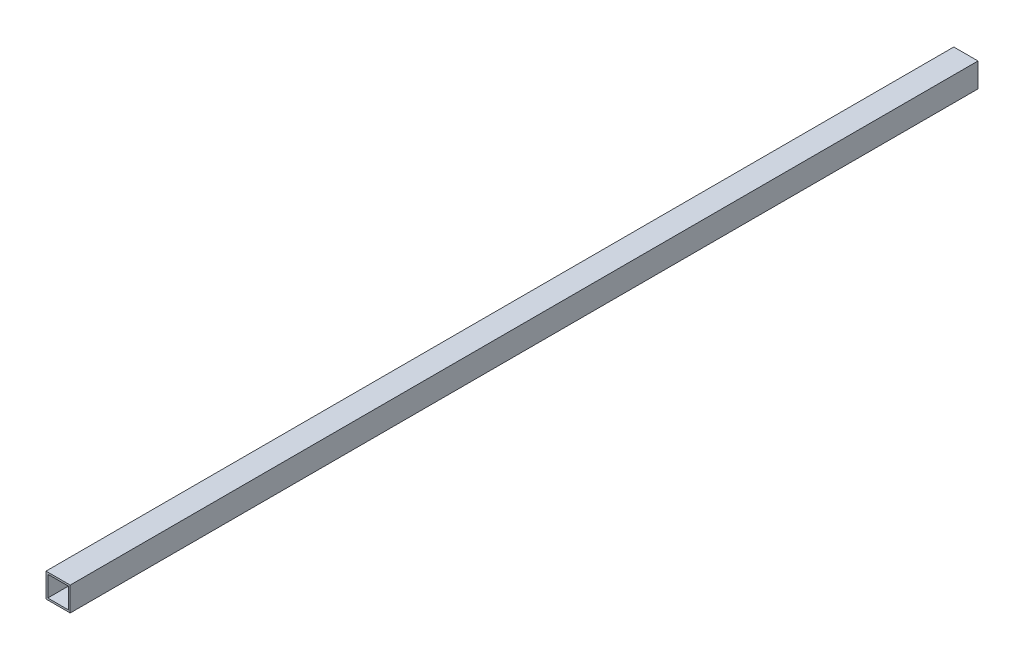
ISO-10303-21;
HEADER;
FILE_DESCRIPTION(('STEP AP214'),'2;1');
FILE_NAME('part.step','',(''),(''),'','','');
FILE_SCHEMA(('AUTOMOTIVE_DESIGN { 1 0 10303 214 1 1 1 1 }'));
ENDSEC;
DATA;
#1=APPLICATION_CONTEXT('core data for automotive mechanical design processes');
#2=APPLICATION_PROTOCOL_DEFINITION('international standard','automotive_design',2000,#1);
#3=PRODUCT_CONTEXT('',#1,'mechanical');
#4=PRODUCT('Part','Part','',(#3));
#5=PRODUCT_RELATED_PRODUCT_CATEGORY('part','',(#4));
#6=PRODUCT_DEFINITION_FORMATION('','',#4);
#7=PRODUCT_DEFINITION_CONTEXT('part definition',#1,'design');
#8=PRODUCT_DEFINITION('design','',#6,#7);
#9=PRODUCT_DEFINITION_SHAPE('','',#8);
#10=(LENGTH_UNIT() NAMED_UNIT(*) SI_UNIT(.MILLI.,.METRE.));
#11=(NAMED_UNIT(*) PLANE_ANGLE_UNIT() SI_UNIT($,.RADIAN.));
#12=(NAMED_UNIT(*) SI_UNIT($,.STERADIAN.) SOLID_ANGLE_UNIT());
#13=UNCERTAINTY_MEASURE_WITH_UNIT(LENGTH_MEASURE(1.E-05),#10,'distance_accuracy_value','');
#14=(GEOMETRIC_REPRESENTATION_CONTEXT(3) GLOBAL_UNCERTAINTY_ASSIGNED_CONTEXT((#13)) GLOBAL_UNIT_ASSIGNED_CONTEXT((#10,
#11,#12)) REPRESENTATION_CONTEXT('',''));
#15=CARTESIAN_POINT('',(0.,0.,0.));
#16=DIRECTION('',(0.,0.,1.));
#17=DIRECTION('',(1.,0.,0.));
#18=AXIS2_PLACEMENT_3D('',#15,#16,#17);
#19=CARTESIAN_POINT('',(20.,20.,1500.));
#20=DIRECTION('',(-1.,0.,0.));
#21=DIRECTION('',(0.,-1.,0.));
#22=AXIS2_PLACEMENT_3D('',#19,#20,#21);
#23=PLANE('',#22);
#24=DIRECTION('',(0.,1.,0.));
#25=VECTOR('',#24,1.);
#26=CARTESIAN_POINT('',(20.,20.,0.));
#27=LINE('',#26,#25);
#28=CARTESIAN_POINT('',(20.,-20.,0.));
#29=VERTEX_POINT('',#28);
#30=CARTESIAN_POINT('',(20.,20.,0.));
#31=VERTEX_POINT('',#30);
#32=EDGE_CURVE('E131',#29,#31,#27,.T.);
#33=ORIENTED_EDGE('',*,*,#32,.T.);
#34=DIRECTION('',(0.,0.,-1.));
#35=VECTOR('',#34,1.);
#36=CARTESIAN_POINT('',(20.,20.,1500.));
#37=LINE('',#36,#35);
#38=CARTESIAN_POINT('',(20.,20.,1500.));
#39=VERTEX_POINT('',#38);
#40=EDGE_CURVE('E11',#39,#31,#37,.T.);
#41=ORIENTED_EDGE('',*,*,#40,.F.);
#42=DIRECTION('',(0.,1.,0.));
#43=VECTOR('',#42,1.);
#44=CARTESIAN_POINT('',(20.,20.,1500.));
#45=LINE('',#44,#43);
#46=CARTESIAN_POINT('',(20.,-20.,1500.));
#47=VERTEX_POINT('',#46);
#48=EDGE_CURVE('E135',#47,#39,#45,.T.);
#49=ORIENTED_EDGE('',*,*,#48,.F.);
#50=DIRECTION('',(0.,0.,-1.));
#51=VECTOR('',#50,1.);
#52=CARTESIAN_POINT('',(20.,-20.,1500.));
#53=LINE('',#52,#51);
#54=EDGE_CURVE('E145',#47,#29,#53,.T.);
#55=ORIENTED_EDGE('',*,*,#54,.T.);
#56=EDGE_LOOP('',(#33,#41,#49,#55));
#57=FACE_BOUND('',#56,.T.);
#58=ADVANCED_FACE('F34',(#57),#23,.F.);
#59=CARTESIAN_POINT('',(-20.,20.,1500.));
#60=DIRECTION('',(0.,-1.,0.));
#61=DIRECTION('',(0.,0.,-1.));
#62=AXIS2_PLACEMENT_3D('',#59,#60,#61);
#63=PLANE('',#62);
#64=DIRECTION('',(-1.,0.,0.));
#65=VECTOR('',#64,1.);
#66=CARTESIAN_POINT('',(-20.,20.,0.));
#67=LINE('',#66,#65);
#68=CARTESIAN_POINT('',(-20.,20.,0.));
#69=VERTEX_POINT('',#68);
#70=EDGE_CURVE('E148',#31,#69,#67,.T.);
#71=ORIENTED_EDGE('',*,*,#70,.T.);
#72=DIRECTION('',(0.,0.,-1.));
#73=VECTOR('',#72,1.);
#74=CARTESIAN_POINT('',(-20.,20.,1500.));
#75=LINE('',#74,#73);
#76=CARTESIAN_POINT('',(-20.,20.,1500.));
#77=VERTEX_POINT('',#76);
#78=EDGE_CURVE('E41',#77,#69,#75,.T.);
#79=ORIENTED_EDGE('',*,*,#78,.F.);
#80=DIRECTION('',(-1.,0.,0.));
#81=VECTOR('',#80,1.);
#82=CARTESIAN_POINT('',(-20.,20.,1500.));
#83=LINE('',#82,#81);
#84=EDGE_CURVE('E138',#39,#77,#83,.T.);
#85=ORIENTED_EDGE('',*,*,#84,.F.);
#86=ORIENTED_EDGE('',*,*,#40,.T.);
#87=EDGE_LOOP('',(#71,#79,#85,#86));
#88=FACE_BOUND('',#87,.T.);
#89=ADVANCED_FACE('F176',(#88),#63,.F.);
#90=CARTESIAN_POINT('',(-20.,20.,1500.));
#91=DIRECTION('',(1.,0.,0.));
#92=DIRECTION('',(0.,0.,-1.));
#93=AXIS2_PLACEMENT_3D('',#90,#91,#92);
#94=PLANE('',#93);
#95=DIRECTION('',(0.,-1.,0.));
#96=VECTOR('',#95,1.);
#97=CARTESIAN_POINT('',(-20.,20.,0.));
#98=LINE('',#97,#96);
#99=CARTESIAN_POINT('',(-20.,-20.,0.));
#100=VERTEX_POINT('',#99);
#101=EDGE_CURVE('E150',#69,#100,#98,.T.);
#102=ORIENTED_EDGE('',*,*,#101,.T.);
#103=DIRECTION('',(0.,0.,-1.));
#104=VECTOR('',#103,1.);
#105=CARTESIAN_POINT('',(-20.,-20.,1500.));
#106=LINE('',#105,#104);
#107=CARTESIAN_POINT('',(-20.,-20.,1500.));
#108=VERTEX_POINT('',#107);
#109=EDGE_CURVE('E155',#108,#100,#106,.T.);
#110=ORIENTED_EDGE('',*,*,#109,.F.);
#111=DIRECTION('',(0.,-1.,0.));
#112=VECTOR('',#111,1.);
#113=CARTESIAN_POINT('',(-20.,20.,1500.));
#114=LINE('',#113,#112);
#115=EDGE_CURVE('E141',#77,#108,#114,.T.);
#116=ORIENTED_EDGE('',*,*,#115,.F.);
#117=ORIENTED_EDGE('',*,*,#78,.T.);
#118=EDGE_LOOP('',(#102,#110,#116,#117));
#119=FACE_BOUND('',#118,.T.);
#120=ADVANCED_FACE('F162',(#119),#94,.F.);
#121=CARTESIAN_POINT('',(-20.,-20.,1500.));
#122=DIRECTION('',(0.,1.,0.));
#123=DIRECTION('',(0.,0.,1.));
#124=AXIS2_PLACEMENT_3D('',#121,#122,#123);
#125=PLANE('',#124);
#126=DIRECTION('',(1.,0.,0.));
#127=VECTOR('',#126,1.);
#128=CARTESIAN_POINT('',(-20.,-20.,0.));
#129=LINE('',#128,#127);
#130=EDGE_CURVE('E139',#100,#29,#129,.T.);
#131=ORIENTED_EDGE('',*,*,#130,.T.);
#132=ORIENTED_EDGE('',*,*,#54,.F.);
#133=DIRECTION('',(1.,0.,0.));
#134=VECTOR('',#133,1.);
#135=CARTESIAN_POINT('',(-20.,-20.,1500.));
#136=LINE('',#135,#134);
#137=EDGE_CURVE('E143',#108,#47,#136,.T.);
#138=ORIENTED_EDGE('',*,*,#137,.F.);
#139=ORIENTED_EDGE('',*,*,#109,.T.);
#140=EDGE_LOOP('',(#131,#132,#138,#139));
#141=FACE_BOUND('',#140,.T.);
#142=ADVANCED_FACE('F171',(#141),#125,.F.);
#143=CARTESIAN_POINT('',(0.,0.,1500.));
#144=DIRECTION('',(0.,0.,1.));
#145=DIRECTION('',(1.,0.,0.));
#146=AXIS2_PLACEMENT_3D('',#143,#144,#145);
#147=PLANE('',#146);
#148=DIRECTION('',(0.,1.,0.));
#149=VECTOR('',#148,1.);
#150=CARTESIAN_POINT('',(-17.,17.,1500.));
#151=LINE('',#150,#149);
#152=CARTESIAN_POINT('',(-17.,-17.,1500.));
#153=VERTEX_POINT('',#152);
#154=CARTESIAN_POINT('',(-17.,17.,1500.));
#155=VERTEX_POINT('',#154);
#156=EDGE_CURVE('E100',#153,#155,#151,.T.);
#157=ORIENTED_EDGE('',*,*,#156,.T.);
#158=DIRECTION('',(1.,0.,0.));
#159=VECTOR('',#158,1.);
#160=CARTESIAN_POINT('',(17.,17.,1500.));
#161=LINE('',#160,#159);
#162=CARTESIAN_POINT('',(17.,17.,1500.));
#163=VERTEX_POINT('',#162);
#164=EDGE_CURVE('E109',#155,#163,#161,.T.);
#165=ORIENTED_EDGE('',*,*,#164,.T.);
#166=DIRECTION('',(0.,-1.,0.));
#167=VECTOR('',#166,1.);
#168=CARTESIAN_POINT('',(17.,17.,1500.));
#169=LINE('',#168,#167);
#170=CARTESIAN_POINT('',(17.,-17.,1500.));
#171=VERTEX_POINT('',#170);
#172=EDGE_CURVE('E48',#163,#171,#169,.T.);
#173=ORIENTED_EDGE('',*,*,#172,.T.);
#174=DIRECTION('',(-1.,0.,0.));
#175=VECTOR('',#174,1.);
#176=CARTESIAN_POINT('',(17.,-17.,1500.));
#177=LINE('',#176,#175);
#178=EDGE_CURVE('E106',#171,#153,#177,.T.);
#179=ORIENTED_EDGE('',*,*,#178,.T.);
#180=EDGE_LOOP('',(#157,#165,#173,#179));
#181=FACE_BOUND('',#180,.T.);
#182=ORIENTED_EDGE('',*,*,#48,.T.);
#183=ORIENTED_EDGE('',*,*,#84,.T.);
#184=ORIENTED_EDGE('',*,*,#115,.T.);
#185=ORIENTED_EDGE('',*,*,#137,.T.);
#186=EDGE_LOOP('',(#182,#183,#184,#185));
#187=FACE_BOUND('',#186,.T.);
#188=ADVANCED_FACE('F113',(#181,#187),#147,.T.);
#189=CARTESIAN_POINT('',(0.,0.,0.));
#190=DIRECTION('',(0.,0.,1.));
#191=DIRECTION('',(1.,0.,0.));
#192=AXIS2_PLACEMENT_3D('',#189,#190,#191);
#193=PLANE('',#192);
#194=DIRECTION('',(1.,0.,0.));
#195=VECTOR('',#194,1.);
#196=CARTESIAN_POINT('',(17.,17.,0.));
#197=LINE('',#196,#195);
#198=CARTESIAN_POINT('',(-17.,17.,0.));
#199=VERTEX_POINT('',#198);
#200=CARTESIAN_POINT('',(17.,17.,0.));
#201=VERTEX_POINT('',#200);
#202=EDGE_CURVE('E125',#199,#201,#197,.T.);
#203=ORIENTED_EDGE('',*,*,#202,.F.);
#204=DIRECTION('',(0.,1.,0.));
#205=VECTOR('',#204,1.);
#206=CARTESIAN_POINT('',(-17.,17.,0.));
#207=LINE('',#206,#205);
#208=CARTESIAN_POINT('',(-17.,-17.,0.));
#209=VERTEX_POINT('',#208);
#210=EDGE_CURVE('E56',#209,#199,#207,.T.);
#211=ORIENTED_EDGE('',*,*,#210,.F.);
#212=DIRECTION('',(-1.,0.,0.));
#213=VECTOR('',#212,1.);
#214=CARTESIAN_POINT('',(17.,-17.,0.));
#215=LINE('',#214,#213);
#216=CARTESIAN_POINT('',(17.,-17.,0.));
#217=VERTEX_POINT('',#216);
#218=EDGE_CURVE('E116',#217,#209,#215,.T.);
#219=ORIENTED_EDGE('',*,*,#218,.F.);
#220=DIRECTION('',(0.,-1.,0.));
#221=VECTOR('',#220,1.);
#222=CARTESIAN_POINT('',(17.,17.,0.));
#223=LINE('',#222,#221);
#224=EDGE_CURVE('E119',#201,#217,#223,.T.);
#225=ORIENTED_EDGE('',*,*,#224,.F.);
#226=EDGE_LOOP('',(#203,#211,#219,#225));
#227=FACE_BOUND('',#226,.T.);
#228=ORIENTED_EDGE('',*,*,#32,.F.);
#229=ORIENTED_EDGE('',*,*,#130,.F.);
#230=ORIENTED_EDGE('',*,*,#101,.F.);
#231=ORIENTED_EDGE('',*,*,#70,.F.);
#232=EDGE_LOOP('',(#228,#229,#230,#231));
#233=FACE_BOUND('',#232,.T.);
#234=ADVANCED_FACE('F168',(#227,#233),#193,.F.);
#235=CARTESIAN_POINT('',(-17.,17.,1500.));
#236=DIRECTION('',(-1.,0.,0.));
#237=DIRECTION('',(0.,-1.,0.));
#238=AXIS2_PLACEMENT_3D('',#235,#236,#237);
#239=PLANE('',#238);
#240=ORIENTED_EDGE('',*,*,#210,.T.);
#241=DIRECTION('',(0.,0.,-1.));
#242=VECTOR('',#241,1.);
#243=CARTESIAN_POINT('',(-17.,17.,1500.));
#244=LINE('',#243,#242);
#245=EDGE_CURVE('E96',#155,#199,#244,.T.);
#246=ORIENTED_EDGE('',*,*,#245,.F.);
#247=ORIENTED_EDGE('',*,*,#156,.F.);
#248=DIRECTION('',(0.,0.,-1.));
#249=VECTOR('',#248,1.);
#250=CARTESIAN_POINT('',(-17.,-17.,1500.));
#251=LINE('',#250,#249);
#252=EDGE_CURVE('E129',#153,#209,#251,.T.);
#253=ORIENTED_EDGE('',*,*,#252,.T.);
#254=EDGE_LOOP('',(#240,#246,#247,#253));
#255=FACE_BOUND('',#254,.T.);
#256=ADVANCED_FACE('F98',(#255),#239,.F.);
#257=CARTESIAN_POINT('',(17.,-17.,1500.));
#258=DIRECTION('',(0.,-1.,0.));
#259=DIRECTION('',(0.,0.,-1.));
#260=AXIS2_PLACEMENT_3D('',#257,#258,#259);
#261=PLANE('',#260);
#262=ORIENTED_EDGE('',*,*,#218,.T.);
#263=ORIENTED_EDGE('',*,*,#252,.F.);
#264=ORIENTED_EDGE('',*,*,#178,.F.);
#265=DIRECTION('',(0.,0.,-1.));
#266=VECTOR('',#265,1.);
#267=CARTESIAN_POINT('',(17.,-17.,1500.));
#268=LINE('',#267,#266);
#269=EDGE_CURVE('E132',#171,#217,#268,.T.);
#270=ORIENTED_EDGE('',*,*,#269,.T.);
#271=EDGE_LOOP('',(#262,#263,#264,#270));
#272=FACE_BOUND('',#271,.T.);
#273=ADVANCED_FACE('F193',(#272),#261,.F.);
#274=CARTESIAN_POINT('',(17.,17.,1500.));
#275=DIRECTION('',(1.,0.,0.));
#276=DIRECTION('',(0.,1.,0.));
#277=AXIS2_PLACEMENT_3D('',#274,#275,#276);
#278=PLANE('',#277);
#279=ORIENTED_EDGE('',*,*,#224,.T.);
#280=ORIENTED_EDGE('',*,*,#269,.F.);
#281=ORIENTED_EDGE('',*,*,#172,.F.);
#282=DIRECTION('',(0.,0.,-1.));
#283=VECTOR('',#282,1.);
#284=CARTESIAN_POINT('',(17.,17.,1500.));
#285=LINE('',#284,#283);
#286=EDGE_CURVE('E105',#163,#201,#285,.T.);
#287=ORIENTED_EDGE('',*,*,#286,.T.);
#288=EDGE_LOOP('',(#279,#280,#281,#287));
#289=FACE_BOUND('',#288,.T.);
#290=ADVANCED_FACE('F196',(#289),#278,.F.);
#291=CARTESIAN_POINT('',(17.,17.,1500.));
#292=DIRECTION('',(0.,1.,0.));
#293=DIRECTION('',(0.,0.,1.));
#294=AXIS2_PLACEMENT_3D('',#291,#292,#293);
#295=PLANE('',#294);
#296=ORIENTED_EDGE('',*,*,#202,.T.);
#297=ORIENTED_EDGE('',*,*,#286,.F.);
#298=ORIENTED_EDGE('',*,*,#164,.F.);
#299=ORIENTED_EDGE('',*,*,#245,.T.);
#300=EDGE_LOOP('',(#296,#297,#298,#299));
#301=FACE_BOUND('',#300,.T.);
#302=ADVANCED_FACE('F110',(#301),#295,.F.);
#303=CLOSED_SHELL('',(#58,#89,#120,#142,#188,#234,#256,#273,#290,#302));
#304=MANIFOLD_SOLID_BREP('B2',#303);
#305=ADVANCED_BREP_SHAPE_REPRESENTATION('',(#18,#304),#14);
#306=SHAPE_DEFINITION_REPRESENTATION(#9,#305);
ENDSEC;
END-ISO-10303-21;
